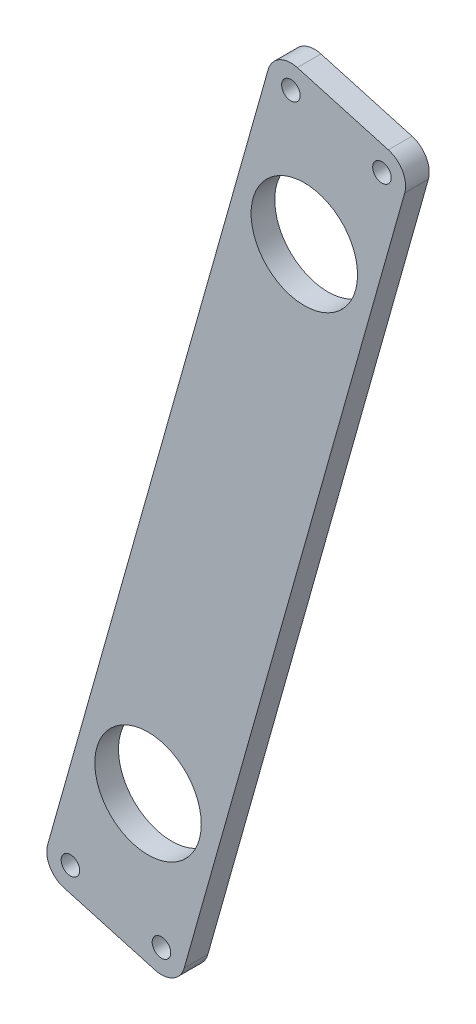
ISO-10303-21;
HEADER;
FILE_DESCRIPTION(('STEP AP214'),'2;1');
FILE_NAME('part.step','',(''),(''),'','','');
FILE_SCHEMA(('AUTOMOTIVE_DESIGN { 1 0 10303 214 1 1 1 1 }'));
ENDSEC;
DATA;
#1=APPLICATION_CONTEXT('core data for automotive mechanical design processes');
#2=APPLICATION_PROTOCOL_DEFINITION('international standard','automotive_design',2000,#1);
#3=PRODUCT_CONTEXT('',#1,'mechanical');
#4=PRODUCT('Part','Part','',(#3));
#5=PRODUCT_RELATED_PRODUCT_CATEGORY('part','',(#4));
#6=PRODUCT_DEFINITION_FORMATION('','',#4);
#7=PRODUCT_DEFINITION_CONTEXT('part definition',#1,'design');
#8=PRODUCT_DEFINITION('design','',#6,#7);
#9=PRODUCT_DEFINITION_SHAPE('','',#8);
#10=(LENGTH_UNIT() NAMED_UNIT(*) SI_UNIT(.MILLI.,.METRE.));
#11=(NAMED_UNIT(*) PLANE_ANGLE_UNIT() SI_UNIT($,.RADIAN.));
#12=(NAMED_UNIT(*) SI_UNIT($,.STERADIAN.) SOLID_ANGLE_UNIT());
#13=UNCERTAINTY_MEASURE_WITH_UNIT(LENGTH_MEASURE(1.E-05),#10,'distance_accuracy_value','');
#14=(GEOMETRIC_REPRESENTATION_CONTEXT(3) GLOBAL_UNCERTAINTY_ASSIGNED_CONTEXT((#13)) GLOBAL_UNIT_ASSIGNED_CONTEXT((#10,
#11,#12)) REPRESENTATION_CONTEXT('',''));
#15=CARTESIAN_POINT('',(0.,0.,0.));
#16=DIRECTION('',(0.,0.,1.));
#17=DIRECTION('',(1.,0.,0.));
#18=AXIS2_PLACEMENT_3D('',#15,#16,#17);
#19=CARTESIAN_POINT('',(0.,0.,6.35));
#20=DIRECTION('',(0.,0.,-1.));
#21=DIRECTION('',(-1.,0.,0.));
#22=AXIS2_PLACEMENT_3D('',#19,#20,#21);
#23=PLANE('',#22);
#24=CARTESIAN_POINT('',(521.786271593927,486.153569232435,6.35));
#25=DIRECTION('',(0.,0.,1.));
#26=DIRECTION('',(1.,0.,0.));
#27=AXIS2_PLACEMENT_3D('',#24,#25,#26);
#28=CIRCLE('',#27,2.48919999999995);
#29=CARTESIAN_POINT('',(524.275471593927,486.153569232435,6.35));
#30=VERTEX_POINT('',#29);
#31=EDGE_CURVE('E211',#30,#30,#28,.T.);
#32=ORIENTED_EDGE('',*,*,#31,.F.);
#33=EDGE_LOOP('',(#32));
#34=FACE_BOUND('',#33,.T.);
#35=CARTESIAN_POINT('',(546.231868962527,479.256267637439,6.35));
#36=DIRECTION('',(0.,0.,1.));
#37=DIRECTION('',(1.,0.,0.));
#38=AXIS2_PLACEMENT_3D('',#35,#36,#37);
#39=CIRCLE('',#38,2.48919999999995);
#40=CARTESIAN_POINT('',(548.721068962527,479.256267637439,6.35));
#41=VERTEX_POINT('',#40);
#42=EDGE_CURVE('E208',#41,#41,#39,.T.);
#43=ORIENTED_EDGE('',*,*,#42,.F.);
#44=EDGE_LOOP('',(#43));
#45=FACE_BOUND('',#44,.T.);
#46=CARTESIAN_POINT('',(462.58673200408,276.337007017747,6.35));
#47=DIRECTION('',(0.,0.,1.));
#48=DIRECTION('',(1.,0.,0.));
#49=AXIS2_PLACEMENT_3D('',#46,#47,#48);
#50=CIRCLE('',#49,2.48920000000001);
#51=CARTESIAN_POINT('',(465.07593200408,276.337007017747,6.35));
#52=VERTEX_POINT('',#51);
#53=EDGE_CURVE('E202',#52,#52,#50,.T.);
#54=ORIENTED_EDGE('',*,*,#53,.F.);
#55=EDGE_LOOP('',(#54));
#56=FACE_BOUND('',#55,.T.);
#57=CARTESIAN_POINT('',(487.032329372679,269.439705422751,6.35));
#58=DIRECTION('',(0.,0.,1.));
#59=DIRECTION('',(1.,0.,0.));
#60=AXIS2_PLACEMENT_3D('',#57,#58,#59);
#61=CIRCLE('',#60,2.48920000000001);
#62=CARTESIAN_POINT('',(489.521529372679,269.439705422751,6.35));
#63=VERTEX_POINT('',#62);
#64=EDGE_CURVE('E196',#63,#63,#61,.T.);
#65=ORIENTED_EDGE('',*,*,#64,.F.);
#66=EDGE_LOOP('',(#65));
#67=FACE_BOUND('',#66,.T.);
#68=DIRECTION('',(-0.962425093251942,0.271547306889593,0.));
#69=VECTOR('',#68,1.);
#70=CARTESIAN_POINT('',(517.399197650526,493.989293973334,6.35));
#71=LINE('',#70,#69);
#72=CARTESIAN_POINT('',(547.956194361275,485.367666979589,6.35));
#73=VERTEX_POINT('',#72);
#74=CARTESIAN_POINT('',(523.510596992676,492.264968574585,6.35));
#75=VERTEX_POINT('',#74);
#76=EDGE_CURVE('E140',#73,#75,#71,.T.);
#77=ORIENTED_EDGE('',*,*,#76,.T.);
#78=CARTESIAN_POINT('',(521.786271593927,486.153569232435,6.35));
#79=DIRECTION('',(0.,0.,-1.));
#80=DIRECTION('',(-1.,0.,0.));
#81=AXIS2_PLACEMENT_3D('',#78,#79,#80);
#82=CIRCLE('',#81,6.35);
#83=CARTESIAN_POINT('',(515.674872251777,487.877894631184,6.35));
#84=VERTEX_POINT('',#83);
#85=EDGE_CURVE('E159',#75,#84,#82,.F.);
#86=ORIENTED_EDGE('',*,*,#85,.T.);
#87=DIRECTION('',(-0.271547306889592,-0.962425093251942,0.));
#88=VECTOR('',#87,1.);
#89=CARTESIAN_POINT('',(454.751007263181,271.949933074346,6.35));
#90=LINE('',#89,#88);
#91=CARTESIAN_POINT('',(456.47533266193,278.061332416496,6.35));
#92=VERTEX_POINT('',#91);
#93=EDGE_CURVE('E123',#84,#92,#90,.T.);
#94=ORIENTED_EDGE('',*,*,#93,.T.);
#95=CARTESIAN_POINT('',(462.58673200408,276.337007017747,6.35));
#96=DIRECTION('',(0.,0.,-1.));
#97=DIRECTION('',(-1.,0.,0.));
#98=AXIS2_PLACEMENT_3D('',#95,#96,#97);
#99=CIRCLE('',#98,6.35);
#100=CARTESIAN_POINT('',(460.862406605331,270.225607675597,6.35));
#101=VERTEX_POINT('',#100);
#102=EDGE_CURVE('E154',#92,#101,#99,.F.);
#103=ORIENTED_EDGE('',*,*,#102,.T.);
#104=DIRECTION('',(0.962425093251942,-0.271547306889592,0.));
#105=VECTOR('',#104,1.);
#106=CARTESIAN_POINT('',(454.751007263181,271.949933074346,6.35));
#107=LINE('',#106,#105);
#108=CARTESIAN_POINT('',(485.30800397393,263.328306080601,6.35));
#109=VERTEX_POINT('',#108);
#110=EDGE_CURVE('E170',#101,#109,#107,.T.);
#111=ORIENTED_EDGE('',*,*,#110,.T.);
#112=CARTESIAN_POINT('',(487.032329372679,269.439705422751,6.35));
#113=DIRECTION('',(0.,0.,-1.));
#114=DIRECTION('',(-1.,0.,0.));
#115=AXIS2_PLACEMENT_3D('',#112,#113,#114);
#116=CIRCLE('',#115,6.35);
#117=CARTESIAN_POINT('',(493.143728714829,267.715380024002,6.35));
#118=VERTEX_POINT('',#117);
#119=EDGE_CURVE('E59',#109,#118,#116,.F.);
#120=ORIENTED_EDGE('',*,*,#119,.T.);
#121=DIRECTION('',(0.271547306889592,0.962425093251942,0.));
#122=VECTOR('',#121,1.);
#123=CARTESIAN_POINT('',(491.41940331608,261.603980681853,6.35));
#124=LINE('',#123,#122);
#125=CARTESIAN_POINT('',(552.343268304676,477.531942238691,6.35));
#126=VERTEX_POINT('',#125);
#127=EDGE_CURVE('E178',#118,#126,#124,.T.);
#128=ORIENTED_EDGE('',*,*,#127,.T.);
#129=CARTESIAN_POINT('',(546.231868962527,479.256267637439,6.35));
#130=DIRECTION('',(0.,0.,-1.));
#131=DIRECTION('',(-1.,0.,0.));
#132=AXIS2_PLACEMENT_3D('',#129,#130,#131);
#133=CIRCLE('',#132,6.35);
#134=EDGE_CURVE('E157',#126,#73,#133,.F.);
#135=ORIENTED_EDGE('',*,*,#134,.T.);
#136=EDGE_LOOP('',(#77,#86,#94,#103,#111,#120,#128,#135));
#137=FACE_BOUND('',#136,.T.);
#138=CARTESIAN_POINT('',(483.431157682126,303.445352930998,6.35));
#139=DIRECTION('',(0.,0.,1.));
#140=DIRECTION('',(1.,0.,0.));
#141=AXIS2_PLACEMENT_3D('',#138,#139,#140);
#142=CIRCLE('',#141,14.2875);
#143=CARTESIAN_POINT('',(497.718657682126,303.445352930998,6.35));
#144=VERTEX_POINT('',#143);
#145=EDGE_CURVE('E131',#144,#144,#142,.T.);
#146=ORIENTED_EDGE('',*,*,#145,.F.);
#147=EDGE_LOOP('',(#146));
#148=FACE_BOUND('',#147,.T.);
#149=CARTESIAN_POINT('',(525.387443284485,452.147921724187,6.35));
#150=DIRECTION('',(0.,0.,1.));
#151=DIRECTION('',(1.,0.,0.));
#152=AXIS2_PLACEMENT_3D('',#149,#150,#151);
#153=CIRCLE('',#152,14.2875);
#154=CARTESIAN_POINT('',(539.674943284485,452.147921724187,6.35));
#155=VERTEX_POINT('',#154);
#156=EDGE_CURVE('E185',#155,#155,#153,.T.);
#157=ORIENTED_EDGE('',*,*,#156,.F.);
#158=EDGE_LOOP('',(#157));
#159=FACE_BOUND('',#158,.T.);
#160=ADVANCED_FACE('F37',(#34,#45,#56,#67,#137,#148,#159),#23,.F.);
#161=CARTESIAN_POINT('',(0.,0.,0.));
#162=DIRECTION('',(0.,0.,-1.));
#163=DIRECTION('',(-1.,0.,0.));
#164=AXIS2_PLACEMENT_3D('',#161,#162,#163);
#165=PLANE('',#164);
#166=CARTESIAN_POINT('',(521.786271593927,486.153569232435,0.));
#167=DIRECTION('',(0.,0.,1.));
#168=DIRECTION('',(1.,0.,0.));
#169=AXIS2_PLACEMENT_3D('',#166,#167,#168);
#170=CIRCLE('',#169,2.48919999999995);
#171=CARTESIAN_POINT('',(524.275471593927,486.153569232435,0.));
#172=VERTEX_POINT('',#171);
#173=EDGE_CURVE('E190',#172,#172,#170,.T.);
#174=ORIENTED_EDGE('',*,*,#173,.T.);
#175=EDGE_LOOP('',(#174));
#176=FACE_BOUND('',#175,.T.);
#177=CARTESIAN_POINT('',(546.231868962527,479.256267637439,0.));
#178=DIRECTION('',(0.,0.,1.));
#179=DIRECTION('',(1.,0.,0.));
#180=AXIS2_PLACEMENT_3D('',#177,#178,#179);
#181=CIRCLE('',#180,2.48919999999995);
#182=CARTESIAN_POINT('',(548.721068962527,479.256267637439,0.));
#183=VERTEX_POINT('',#182);
#184=EDGE_CURVE('E205',#183,#183,#181,.T.);
#185=ORIENTED_EDGE('',*,*,#184,.T.);
#186=EDGE_LOOP('',(#185));
#187=FACE_BOUND('',#186,.T.);
#188=CARTESIAN_POINT('',(462.58673200408,276.337007017747,0.));
#189=DIRECTION('',(0.,0.,1.));
#190=DIRECTION('',(1.,0.,0.));
#191=AXIS2_PLACEMENT_3D('',#188,#189,#190);
#192=CIRCLE('',#191,2.48920000000001);
#193=CARTESIAN_POINT('',(465.07593200408,276.337007017747,0.));
#194=VERTEX_POINT('',#193);
#195=EDGE_CURVE('E199',#194,#194,#192,.T.);
#196=ORIENTED_EDGE('',*,*,#195,.T.);
#197=EDGE_LOOP('',(#196));
#198=FACE_BOUND('',#197,.T.);
#199=CARTESIAN_POINT('',(487.032329372679,269.439705422751,0.));
#200=DIRECTION('',(0.,0.,1.));
#201=DIRECTION('',(1.,0.,0.));
#202=AXIS2_PLACEMENT_3D('',#199,#200,#201);
#203=CIRCLE('',#202,2.48920000000001);
#204=CARTESIAN_POINT('',(489.521529372679,269.439705422751,0.));
#205=VERTEX_POINT('',#204);
#206=EDGE_CURVE('E193',#205,#205,#203,.T.);
#207=ORIENTED_EDGE('',*,*,#206,.T.);
#208=EDGE_LOOP('',(#207));
#209=FACE_BOUND('',#208,.T.);
#210=CARTESIAN_POINT('',(483.431157682126,303.445352930998,0.));
#211=DIRECTION('',(0.,0.,1.));
#212=DIRECTION('',(1.,0.,0.));
#213=AXIS2_PLACEMENT_3D('',#210,#211,#212);
#214=CIRCLE('',#213,14.2875);
#215=CARTESIAN_POINT('',(497.718657682126,303.445352930998,0.));
#216=VERTEX_POINT('',#215);
#217=EDGE_CURVE('E137',#216,#216,#214,.T.);
#218=ORIENTED_EDGE('',*,*,#217,.T.);
#219=EDGE_LOOP('',(#218));
#220=FACE_BOUND('',#219,.T.);
#221=DIRECTION('',(-0.271547306889592,-0.962425093251942,0.));
#222=VECTOR('',#221,1.);
#223=CARTESIAN_POINT('',(454.751007263181,271.949933074346,0.));
#224=LINE('',#223,#222);
#225=CARTESIAN_POINT('',(515.674872251777,487.877894631184,0.));
#226=VERTEX_POINT('',#225);
#227=CARTESIAN_POINT('',(456.47533266193,278.061332416496,0.));
#228=VERTEX_POINT('',#227);
#229=EDGE_CURVE('E120',#226,#228,#224,.T.);
#230=ORIENTED_EDGE('',*,*,#229,.F.);
#231=CARTESIAN_POINT('',(521.786271593927,486.153569232435,0.));
#232=DIRECTION('',(0.,0.,-1.));
#233=DIRECTION('',(-1.,0.,0.));
#234=AXIS2_PLACEMENT_3D('',#231,#232,#233);
#235=CIRCLE('',#234,6.35);
#236=CARTESIAN_POINT('',(523.510596992676,492.264968574585,0.));
#237=VERTEX_POINT('',#236);
#238=EDGE_CURVE('E103',#226,#237,#235,.T.);
#239=ORIENTED_EDGE('',*,*,#238,.T.);
#240=DIRECTION('',(-0.962425093251942,0.271547306889593,0.));
#241=VECTOR('',#240,1.);
#242=CARTESIAN_POINT('',(517.399197650526,493.989293973334,0.));
#243=LINE('',#242,#241);
#244=CARTESIAN_POINT('',(547.956194361275,485.367666979589,0.));
#245=VERTEX_POINT('',#244);
#246=EDGE_CURVE('E144',#245,#237,#243,.T.);
#247=ORIENTED_EDGE('',*,*,#246,.F.);
#248=CARTESIAN_POINT('',(546.231868962527,479.256267637439,0.));
#249=DIRECTION('',(0.,0.,-1.));
#250=DIRECTION('',(-1.,0.,0.));
#251=AXIS2_PLACEMENT_3D('',#248,#249,#250);
#252=CIRCLE('',#251,6.35);
#253=CARTESIAN_POINT('',(552.343268304676,477.531942238691,0.));
#254=VERTEX_POINT('',#253);
#255=EDGE_CURVE('E114',#245,#254,#252,.T.);
#256=ORIENTED_EDGE('',*,*,#255,.T.);
#257=DIRECTION('',(0.271547306889592,0.962425093251942,0.));
#258=VECTOR('',#257,1.);
#259=CARTESIAN_POINT('',(491.41940331608,261.603980681853,0.));
#260=LINE('',#259,#258);
#261=CARTESIAN_POINT('',(493.143728714829,267.715380024002,0.));
#262=VERTEX_POINT('',#261);
#263=EDGE_CURVE('E134',#262,#254,#260,.T.);
#264=ORIENTED_EDGE('',*,*,#263,.F.);
#265=CARTESIAN_POINT('',(487.032329372679,269.439705422751,0.));
#266=DIRECTION('',(0.,0.,-1.));
#267=DIRECTION('',(-1.,0.,0.));
#268=AXIS2_PLACEMENT_3D('',#265,#266,#267);
#269=CIRCLE('',#268,6.35);
#270=CARTESIAN_POINT('',(485.30800397393,263.328306080601,0.));
#271=VERTEX_POINT('',#270);
#272=EDGE_CURVE('E148',#262,#271,#269,.T.);
#273=ORIENTED_EDGE('',*,*,#272,.T.);
#274=DIRECTION('',(0.962425093251942,-0.271547306889592,0.));
#275=VECTOR('',#274,1.);
#276=CARTESIAN_POINT('',(454.751007263181,271.949933074346,0.));
#277=LINE('',#276,#275);
#278=CARTESIAN_POINT('',(460.862406605331,270.225607675597,0.));
#279=VERTEX_POINT('',#278);
#280=EDGE_CURVE('E130',#279,#271,#277,.T.);
#281=ORIENTED_EDGE('',*,*,#280,.F.);
#282=CARTESIAN_POINT('',(462.58673200408,276.337007017747,0.));
#283=DIRECTION('',(0.,0.,-1.));
#284=DIRECTION('',(-1.,0.,0.));
#285=AXIS2_PLACEMENT_3D('',#282,#283,#284);
#286=CIRCLE('',#285,6.35);
#287=EDGE_CURVE('E124',#279,#228,#286,.T.);
#288=ORIENTED_EDGE('',*,*,#287,.T.);
#289=EDGE_LOOP('',(#230,#239,#247,#256,#264,#273,#281,#288));
#290=FACE_BOUND('',#289,.T.);
#291=CARTESIAN_POINT('',(525.387443284485,452.147921724187,0.));
#292=DIRECTION('',(0.,0.,1.));
#293=DIRECTION('',(1.,0.,0.));
#294=AXIS2_PLACEMENT_3D('',#291,#292,#293);
#295=CIRCLE('',#294,14.2875);
#296=CARTESIAN_POINT('',(539.674943284485,452.147921724187,0.));
#297=VERTEX_POINT('',#296);
#298=EDGE_CURVE('E187',#297,#297,#295,.T.);
#299=ORIENTED_EDGE('',*,*,#298,.T.);
#300=EDGE_LOOP('',(#299));
#301=FACE_BOUND('',#300,.T.);
#302=ADVANCED_FACE('F127',(#176,#187,#198,#209,#220,#290,#301),#165,.T.);
#303=CARTESIAN_POINT('',(454.751007263181,271.949933074346,6.35));
#304=DIRECTION('',(0.962425093251942,-0.271547306889592,0.));
#305=DIRECTION('',(0.271547306889592,0.962425093251942,0.));
#306=AXIS2_PLACEMENT_3D('',#303,#304,#305);
#307=PLANE('',#306);
#308=ORIENTED_EDGE('',*,*,#93,.F.);
#309=DIRECTION('',(0.,0.,-1.));
#310=VECTOR('',#309,1.);
#311=CARTESIAN_POINT('',(515.674872251777,487.877894631184,6.35));
#312=LINE('',#311,#310);
#313=EDGE_CURVE('E107',#84,#226,#312,.T.);
#314=ORIENTED_EDGE('',*,*,#313,.T.);
#315=ORIENTED_EDGE('',*,*,#229,.T.);
#316=DIRECTION('',(0.,0.,-1.));
#317=VECTOR('',#316,1.);
#318=CARTESIAN_POINT('',(456.47533266193,278.061332416496,6.35));
#319=LINE('',#318,#317);
#320=EDGE_CURVE('E125',#228,#92,#319,.F.);
#321=ORIENTED_EDGE('',*,*,#320,.T.);
#322=EDGE_LOOP('',(#308,#314,#315,#321));
#323=FACE_BOUND('',#322,.T.);
#324=ADVANCED_FACE('F119',(#323),#307,.F.);
#325=CARTESIAN_POINT('',(454.751007263181,271.949933074346,6.35));
#326=DIRECTION('',(0.271547306889592,0.962425093251942,0.));
#327=DIRECTION('',(-0.962425093251942,0.271547306889592,0.));
#328=AXIS2_PLACEMENT_3D('',#325,#326,#327);
#329=PLANE('',#328);
#330=ORIENTED_EDGE('',*,*,#280,.T.);
#331=DIRECTION('',(0.,0.,-1.));
#332=VECTOR('',#331,1.);
#333=CARTESIAN_POINT('',(485.30800397393,263.328306080601,6.35));
#334=LINE('',#333,#332);
#335=EDGE_CURVE('E11',#271,#109,#334,.F.);
#336=ORIENTED_EDGE('',*,*,#335,.T.);
#337=ORIENTED_EDGE('',*,*,#110,.F.);
#338=DIRECTION('',(0.,0.,-1.));
#339=VECTOR('',#338,1.);
#340=CARTESIAN_POINT('',(460.862406605331,270.225607675597,6.35));
#341=LINE('',#340,#339);
#342=EDGE_CURVE('E45',#101,#279,#341,.T.);
#343=ORIENTED_EDGE('',*,*,#342,.T.);
#344=EDGE_LOOP('',(#330,#336,#337,#343));
#345=FACE_BOUND('',#344,.T.);
#346=ADVANCED_FACE('F168',(#345),#329,.F.);
#347=CARTESIAN_POINT('',(491.41940331608,261.603980681853,6.35));
#348=DIRECTION('',(-0.962425093251942,0.271547306889592,0.));
#349=DIRECTION('',(-0.271547306889592,-0.962425093251942,0.));
#350=AXIS2_PLACEMENT_3D('',#347,#348,#349);
#351=PLANE('',#350);
#352=ORIENTED_EDGE('',*,*,#263,.T.);
#353=DIRECTION('',(0.,0.,-1.));
#354=VECTOR('',#353,1.);
#355=CARTESIAN_POINT('',(552.343268304676,477.531942238691,6.35));
#356=LINE('',#355,#354);
#357=EDGE_CURVE('E52',#254,#126,#356,.F.);
#358=ORIENTED_EDGE('',*,*,#357,.T.);
#359=ORIENTED_EDGE('',*,*,#127,.F.);
#360=DIRECTION('',(0.,0.,-1.));
#361=VECTOR('',#360,1.);
#362=CARTESIAN_POINT('',(493.143728714829,267.715380024002,6.35));
#363=LINE('',#362,#361);
#364=EDGE_CURVE('E161',#118,#262,#363,.T.);
#365=ORIENTED_EDGE('',*,*,#364,.T.);
#366=EDGE_LOOP('',(#352,#358,#359,#365));
#367=FACE_BOUND('',#366,.T.);
#368=ADVANCED_FACE('F177',(#367),#351,.F.);
#369=CARTESIAN_POINT('',(517.399197650526,493.989293973334,6.35));
#370=DIRECTION('',(-0.271547306889593,-0.962425093251942,0.));
#371=DIRECTION('',(0.962425093251942,-0.271547306889593,0.));
#372=AXIS2_PLACEMENT_3D('',#369,#370,#371);
#373=PLANE('',#372);
#374=ORIENTED_EDGE('',*,*,#246,.T.);
#375=DIRECTION('',(0.,0.,-1.));
#376=VECTOR('',#375,1.);
#377=CARTESIAN_POINT('',(523.510596992676,492.264968574585,6.35));
#378=LINE('',#377,#376);
#379=EDGE_CURVE('E108',#237,#75,#378,.F.);
#380=ORIENTED_EDGE('',*,*,#379,.T.);
#381=ORIENTED_EDGE('',*,*,#76,.F.);
#382=DIRECTION('',(0.,0.,-1.));
#383=VECTOR('',#382,1.);
#384=CARTESIAN_POINT('',(547.956194361275,485.367666979589,6.35));
#385=LINE('',#384,#383);
#386=EDGE_CURVE('E113',#73,#245,#385,.T.);
#387=ORIENTED_EDGE('',*,*,#386,.T.);
#388=EDGE_LOOP('',(#374,#380,#381,#387));
#389=FACE_BOUND('',#388,.T.);
#390=ADVANCED_FACE('F254',(#389),#373,.F.);
#391=CARTESIAN_POINT('',(483.431157682126,303.445352930998,6.35));
#392=DIRECTION('',(0.,0.,-1.));
#393=DIRECTION('',(-1.,0.,0.));
#394=AXIS2_PLACEMENT_3D('',#391,#392,#393);
#395=CYLINDRICAL_SURFACE('',#394,14.2875);
#396=ORIENTED_EDGE('',*,*,#145,.T.);
#397=EDGE_LOOP('',(#396));
#398=FACE_BOUND('',#397,.T.);
#399=ORIENTED_EDGE('',*,*,#217,.F.);
#400=EDGE_LOOP('',(#399));
#401=FACE_BOUND('',#400,.T.);
#402=ADVANCED_FACE('F243',(#398,#401),#395,.F.);
#403=CARTESIAN_POINT('',(525.387443284485,452.147921724187,6.35));
#404=DIRECTION('',(0.,0.,-1.));
#405=DIRECTION('',(-1.,0.,0.));
#406=AXIS2_PLACEMENT_3D('',#403,#404,#405);
#407=CYLINDRICAL_SURFACE('',#406,14.2875);
#408=ORIENTED_EDGE('',*,*,#156,.T.);
#409=EDGE_LOOP('',(#408));
#410=FACE_BOUND('',#409,.T.);
#411=ORIENTED_EDGE('',*,*,#298,.F.);
#412=EDGE_LOOP('',(#411));
#413=FACE_BOUND('',#412,.T.);
#414=ADVANCED_FACE('F240',(#410,#413),#407,.F.);
#415=CARTESIAN_POINT('',(521.786271593927,486.153569232435,6.35));
#416=DIRECTION('',(0.,0.,-1.));
#417=DIRECTION('',(-1.,0.,0.));
#418=AXIS2_PLACEMENT_3D('',#415,#416,#417);
#419=CYLINDRICAL_SURFACE('',#418,6.35);
#420=ORIENTED_EDGE('',*,*,#85,.F.);
#421=ORIENTED_EDGE('',*,*,#379,.F.);
#422=ORIENTED_EDGE('',*,*,#238,.F.);
#423=ORIENTED_EDGE('',*,*,#313,.F.);
#424=EDGE_LOOP('',(#420,#421,#422,#423));
#425=FACE_BOUND('',#424,.T.);
#426=ADVANCED_FACE('F106',(#425),#419,.T.);
#427=CARTESIAN_POINT('',(546.231868962527,479.256267637439,6.35));
#428=DIRECTION('',(0.,0.,-1.));
#429=DIRECTION('',(-1.,0.,0.));
#430=AXIS2_PLACEMENT_3D('',#427,#428,#429);
#431=CYLINDRICAL_SURFACE('',#430,6.35);
#432=ORIENTED_EDGE('',*,*,#134,.F.);
#433=ORIENTED_EDGE('',*,*,#357,.F.);
#434=ORIENTED_EDGE('',*,*,#255,.F.);
#435=ORIENTED_EDGE('',*,*,#386,.F.);
#436=EDGE_LOOP('',(#432,#433,#434,#435));
#437=FACE_BOUND('',#436,.T.);
#438=ADVANCED_FACE('F264',(#437),#431,.T.);
#439=CARTESIAN_POINT('',(487.032329372679,269.439705422751,6.35));
#440=DIRECTION('',(0.,0.,-1.));
#441=DIRECTION('',(-1.,0.,0.));
#442=AXIS2_PLACEMENT_3D('',#439,#440,#441);
#443=CYLINDRICAL_SURFACE('',#442,6.35);
#444=ORIENTED_EDGE('',*,*,#119,.F.);
#445=ORIENTED_EDGE('',*,*,#335,.F.);
#446=ORIENTED_EDGE('',*,*,#272,.F.);
#447=ORIENTED_EDGE('',*,*,#364,.F.);
#448=EDGE_LOOP('',(#444,#445,#446,#447));
#449=FACE_BOUND('',#448,.T.);
#450=ADVANCED_FACE('F176',(#449),#443,.T.);
#451=CARTESIAN_POINT('',(462.58673200408,276.337007017747,6.35));
#452=DIRECTION('',(0.,0.,-1.));
#453=DIRECTION('',(-1.,0.,0.));
#454=AXIS2_PLACEMENT_3D('',#451,#452,#453);
#455=CYLINDRICAL_SURFACE('',#454,6.35);
#456=ORIENTED_EDGE('',*,*,#102,.F.);
#457=ORIENTED_EDGE('',*,*,#320,.F.);
#458=ORIENTED_EDGE('',*,*,#287,.F.);
#459=ORIENTED_EDGE('',*,*,#342,.F.);
#460=EDGE_LOOP('',(#456,#457,#458,#459));
#461=FACE_BOUND('',#460,.T.);
#462=ADVANCED_FACE('F39',(#461),#455,.T.);
#463=CARTESIAN_POINT('',(487.032329372679,269.439705422751,0.));
#464=DIRECTION('',(0.,0.,1.));
#465=DIRECTION('',(1.,0.,0.));
#466=AXIS2_PLACEMENT_3D('',#463,#464,#465);
#467=CYLINDRICAL_SURFACE('',#466,2.48920000000001);
#468=ORIENTED_EDGE('',*,*,#206,.F.);
#469=EDGE_LOOP('',(#468));
#470=FACE_BOUND('',#469,.T.);
#471=ORIENTED_EDGE('',*,*,#64,.T.);
#472=EDGE_LOOP('',(#471));
#473=FACE_BOUND('',#472,.T.);
#474=ADVANCED_FACE('F271',(#470,#473),#467,.F.);
#475=CARTESIAN_POINT('',(462.58673200408,276.337007017747,0.));
#476=DIRECTION('',(0.,0.,1.));
#477=DIRECTION('',(1.,0.,0.));
#478=AXIS2_PLACEMENT_3D('',#475,#476,#477);
#479=CYLINDRICAL_SURFACE('',#478,2.48920000000001);
#480=ORIENTED_EDGE('',*,*,#195,.F.);
#481=EDGE_LOOP('',(#480));
#482=FACE_BOUND('',#481,.T.);
#483=ORIENTED_EDGE('',*,*,#53,.T.);
#484=EDGE_LOOP('',(#483));
#485=FACE_BOUND('',#484,.T.);
#486=ADVANCED_FACE('F275',(#482,#485),#479,.F.);
#487=CARTESIAN_POINT('',(546.231868962527,479.256267637439,0.));
#488=DIRECTION('',(0.,0.,1.));
#489=DIRECTION('',(1.,0.,0.));
#490=AXIS2_PLACEMENT_3D('',#487,#488,#489);
#491=CYLINDRICAL_SURFACE('',#490,2.48919999999995);
#492=ORIENTED_EDGE('',*,*,#184,.F.);
#493=EDGE_LOOP('',(#492));
#494=FACE_BOUND('',#493,.T.);
#495=ORIENTED_EDGE('',*,*,#42,.T.);
#496=EDGE_LOOP('',(#495));
#497=FACE_BOUND('',#496,.T.);
#498=ADVANCED_FACE('F222',(#494,#497),#491,.F.);
#499=CARTESIAN_POINT('',(521.786271593927,486.153569232435,0.));
#500=DIRECTION('',(0.,0.,1.));
#501=DIRECTION('',(1.,0.,0.));
#502=AXIS2_PLACEMENT_3D('',#499,#500,#501);
#503=CYLINDRICAL_SURFACE('',#502,2.48919999999995);
#504=ORIENTED_EDGE('',*,*,#173,.F.);
#505=EDGE_LOOP('',(#504));
#506=FACE_BOUND('',#505,.T.);
#507=ORIENTED_EDGE('',*,*,#31,.T.);
#508=EDGE_LOOP('',(#507));
#509=FACE_BOUND('',#508,.T.);
#510=ADVANCED_FACE('F219',(#506,#509),#503,.F.);
#511=CLOSED_SHELL('',(#160,#302,#324,#346,#368,#390,#402,#414,#426,#438,#450,#462,#474,#486,
#498,#510));
#512=MANIFOLD_SOLID_BREP('B2',#511);
#513=ADVANCED_BREP_SHAPE_REPRESENTATION('',(#18,#512),#14);
#514=SHAPE_DEFINITION_REPRESENTATION(#9,#513);
ENDSEC;
END-ISO-10303-21;
